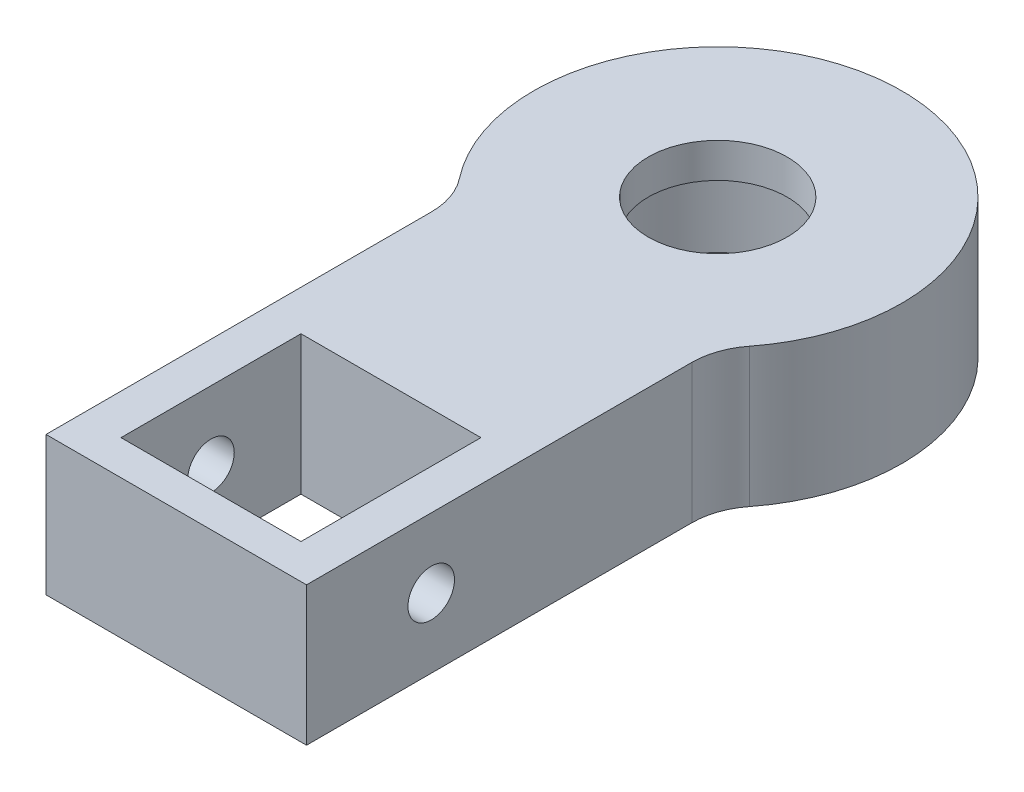
ISO-10303-21;
HEADER;
FILE_DESCRIPTION(('STEP AP214'),'2;1');
FILE_NAME('part.step','',(''),(''),'','','');
FILE_SCHEMA(('AUTOMOTIVE_DESIGN { 1 0 10303 214 1 1 1 1 }'));
ENDSEC;
DATA;
#1=APPLICATION_CONTEXT('core data for automotive mechanical design processes');
#2=APPLICATION_PROTOCOL_DEFINITION('international standard','automotive_design',2000,#1);
#3=PRODUCT_CONTEXT('',#1,'mechanical');
#4=PRODUCT('Part','Part','',(#3));
#5=PRODUCT_RELATED_PRODUCT_CATEGORY('part','',(#4));
#6=PRODUCT_DEFINITION_FORMATION('','',#4);
#7=PRODUCT_DEFINITION_CONTEXT('part definition',#1,'design');
#8=PRODUCT_DEFINITION('design','',#6,#7);
#9=PRODUCT_DEFINITION_SHAPE('','',#8);
#10=(LENGTH_UNIT() NAMED_UNIT(*) SI_UNIT(.MILLI.,.METRE.));
#11=(NAMED_UNIT(*) PLANE_ANGLE_UNIT() SI_UNIT($,.RADIAN.));
#12=(NAMED_UNIT(*) SI_UNIT($,.STERADIAN.) SOLID_ANGLE_UNIT());
#13=UNCERTAINTY_MEASURE_WITH_UNIT(LENGTH_MEASURE(1.E-05),#10,'distance_accuracy_value','');
#14=(GEOMETRIC_REPRESENTATION_CONTEXT(3) GLOBAL_UNCERTAINTY_ASSIGNED_CONTEXT((#13)) GLOBAL_UNIT_ASSIGNED_CONTEXT((#10,
#11,#12)) REPRESENTATION_CONTEXT('',''));
#15=CARTESIAN_POINT('',(0.,0.,0.));
#16=DIRECTION('',(0.,0.,1.));
#17=DIRECTION('',(1.,0.,0.));
#18=AXIS2_PLACEMENT_3D('',#15,#16,#17);
#19=CARTESIAN_POINT('',(0.,10.,0.));
#20=DIRECTION('',(0.,-1.,0.));
#21=DIRECTION('',(0.,0.,-1.));
#22=AXIS2_PLACEMENT_3D('',#19,#20,#21);
#23=CYLINDRICAL_SURFACE('',#22,18.5);
#24=CARTESIAN_POINT('',(0.,-10.,0.));
#25=DIRECTION('',(0.,1.,0.));
#26=DIRECTION('',(0.,0.,1.));
#27=AXIS2_PLACEMENT_3D('',#24,#25,#26);
#28=CIRCLE('',#27,18.5);
#29=CARTESIAN_POINT('',(0.,-10.,18.5));
#30=VERTEX_POINT('',#29);
#31=EDGE_CURVE('E137',#30,#30,#28,.T.);
#32=ORIENTED_EDGE('',*,*,#31,.F.);
#33=EDGE_LOOP('',(#32));
#34=FACE_BOUND('',#33,.T.);
#35=CARTESIAN_POINT('',(0.,5.,0.));
#36=DIRECTION('',(0.,1.,0.));
#37=DIRECTION('',(0.,0.,1.));
#38=AXIS2_PLACEMENT_3D('',#35,#36,#37);
#39=CIRCLE('',#38,18.5);
#40=CARTESIAN_POINT('',(0.,5.,18.5));
#41=VERTEX_POINT('',#40);
#42=EDGE_CURVE('E157',#41,#41,#39,.T.);
#43=ORIENTED_EDGE('',*,*,#42,.T.);
#44=EDGE_LOOP('',(#43));
#45=FACE_BOUND('',#44,.T.);
#46=ADVANCED_FACE('F38',(#34,#45),#23,.F.);
#47=CARTESIAN_POINT('',(0.,10.,0.));
#48=DIRECTION('',(0.,-1.,0.));
#49=DIRECTION('',(0.,0.,-1.));
#50=AXIS2_PLACEMENT_3D('',#47,#48,#49);
#51=PLANE('',#50);
#52=DIRECTION('',(0.,0.,-1.));
#53=VECTOR('',#52,1.);
#54=CARTESIAN_POINT('',(18.754,10.,77.954));
#55=LINE('',#54,#53);
#56=CARTESIAN_POINT('',(18.754,10.,77.954));
#57=VERTEX_POINT('',#56);
#58=CARTESIAN_POINT('',(18.754,10.,22.4823816354051));
#59=VERTEX_POINT('',#58);
#60=EDGE_CURVE('E189',#57,#59,#55,.T.);
#61=ORIENTED_EDGE('',*,*,#60,.T.);
#62=CARTESIAN_POINT('',(28.754,10.,22.4823816354051));
#63=DIRECTION('',(0.,-1.,0.));
#64=DIRECTION('',(0.,0.,-1.));
#65=AXIS2_PLACEMENT_3D('',#62,#63,#64);
#66=CIRCLE('',#65,10.);
#67=CARTESIAN_POINT('',(20.8761917808219,10.,16.3228250229653));
#68=VERTEX_POINT('',#67);
#69=EDGE_CURVE('E11',#59,#68,#66,.T.);
#70=ORIENTED_EDGE('',*,*,#69,.T.);
#71=CARTESIAN_POINT('',(0.,10.,0.));
#72=DIRECTION('',(0.,1.,0.));
#73=DIRECTION('',(0.,0.,-1.));
#74=AXIS2_PLACEMENT_3D('',#71,#72,#73);
#75=CIRCLE('',#74,26.5);
#76=CARTESIAN_POINT('',(-20.8761917808219,10.,16.3228250229653));
#77=VERTEX_POINT('',#76);
#78=EDGE_CURVE('E178',#68,#77,#75,.T.);
#79=ORIENTED_EDGE('',*,*,#78,.T.);
#80=CARTESIAN_POINT('',(-28.754,10.,22.4823816354051));
#81=DIRECTION('',(0.,-1.,0.));
#82=DIRECTION('',(0.,0.,-1.));
#83=AXIS2_PLACEMENT_3D('',#80,#81,#82);
#84=CIRCLE('',#83,10.);
#85=CARTESIAN_POINT('',(-18.754,10.,22.4823816354051));
#86=VERTEX_POINT('',#85);
#87=EDGE_CURVE('E236',#77,#86,#84,.T.);
#88=ORIENTED_EDGE('',*,*,#87,.T.);
#89=DIRECTION('',(0.,0.,1.));
#90=VECTOR('',#89,1.);
#91=CARTESIAN_POINT('',(-18.754,10.,77.954));
#92=LINE('',#91,#90);
#93=CARTESIAN_POINT('',(-18.754,10.,77.954));
#94=VERTEX_POINT('',#93);
#95=EDGE_CURVE('E182',#86,#94,#92,.T.);
#96=ORIENTED_EDGE('',*,*,#95,.T.);
#97=DIRECTION('',(1.,0.,0.));
#98=VECTOR('',#97,1.);
#99=CARTESIAN_POINT('',(-18.754,10.,77.954));
#100=LINE('',#99,#98);
#101=EDGE_CURVE('E186',#94,#57,#100,.T.);
#102=ORIENTED_EDGE('',*,*,#101,.T.);
#103=EDGE_LOOP('',(#61,#70,#79,#88,#96,#102));
#104=FACE_BOUND('',#103,.T.);
#105=DIRECTION('',(0.,0.,-1.));
#106=VECTOR('',#105,1.);
#107=CARTESIAN_POINT('',(12.954,10.,72.954));
#108=LINE('',#107,#106);
#109=CARTESIAN_POINT('',(12.954,10.,72.954));
#110=VERTEX_POINT('',#109);
#111=CARTESIAN_POINT('',(12.954,10.,47.046));
#112=VERTEX_POINT('',#111);
#113=EDGE_CURVE('E117',#110,#112,#108,.T.);
#114=ORIENTED_EDGE('',*,*,#113,.F.);
#115=DIRECTION('',(1.,0.,0.));
#116=VECTOR('',#115,1.);
#117=CARTESIAN_POINT('',(-12.954,10.,72.954));
#118=LINE('',#117,#116);
#119=CARTESIAN_POINT('',(-12.954,10.,72.954));
#120=VERTEX_POINT('',#119);
#121=EDGE_CURVE('E148',#120,#110,#118,.T.);
#122=ORIENTED_EDGE('',*,*,#121,.F.);
#123=DIRECTION('',(0.,0.,1.));
#124=VECTOR('',#123,1.);
#125=CARTESIAN_POINT('',(-12.954,10.,72.954));
#126=LINE('',#125,#124);
#127=CARTESIAN_POINT('',(-12.954,10.,47.046));
#128=VERTEX_POINT('',#127);
#129=EDGE_CURVE('E144',#128,#120,#126,.T.);
#130=ORIENTED_EDGE('',*,*,#129,.F.);
#131=DIRECTION('',(-1.,0.,0.));
#132=VECTOR('',#131,1.);
#133=CARTESIAN_POINT('',(-12.954,10.,47.046));
#134=LINE('',#133,#132);
#135=EDGE_CURVE('E128',#112,#128,#134,.T.);
#136=ORIENTED_EDGE('',*,*,#135,.F.);
#137=EDGE_LOOP('',(#114,#122,#130,#136));
#138=FACE_BOUND('',#137,.T.);
#139=CARTESIAN_POINT('',(0.,10.,0.));
#140=DIRECTION('',(0.,1.,0.));
#141=DIRECTION('',(0.,0.,1.));
#142=AXIS2_PLACEMENT_3D('',#139,#140,#141);
#143=CIRCLE('',#142,10.);
#144=CARTESIAN_POINT('',(0.,10.,10.));
#145=VERTEX_POINT('',#144);
#146=EDGE_CURVE('E346',#145,#145,#143,.T.);
#147=ORIENTED_EDGE('',*,*,#146,.F.);
#148=EDGE_LOOP('',(#147));
#149=FACE_BOUND('',#148,.T.);
#150=ADVANCED_FACE('F141',(#104,#138,#149),#51,.F.);
#151=CARTESIAN_POINT('',(0.,-10.,0.));
#152=DIRECTION('',(0.,-1.,0.));
#153=DIRECTION('',(0.,0.,-1.));
#154=AXIS2_PLACEMENT_3D('',#151,#152,#153);
#155=PLANE('',#154);
#156=CARTESIAN_POINT('',(0.,-10.,0.));
#157=DIRECTION('',(0.,1.,0.));
#158=DIRECTION('',(0.,0.,-1.));
#159=AXIS2_PLACEMENT_3D('',#156,#157,#158);
#160=CIRCLE('',#159,26.5);
#161=CARTESIAN_POINT('',(20.8761917808219,-10.,16.3228250229653));
#162=VERTEX_POINT('',#161);
#163=CARTESIAN_POINT('',(-20.8761917808219,-10.,16.3228250229653));
#164=VERTEX_POINT('',#163);
#165=EDGE_CURVE('E177',#162,#164,#160,.T.);
#166=ORIENTED_EDGE('',*,*,#165,.F.);
#167=CARTESIAN_POINT('',(28.754,-10.,22.4823816354051));
#168=DIRECTION('',(0.,-1.,0.));
#169=DIRECTION('',(0.,0.,-1.));
#170=AXIS2_PLACEMENT_3D('',#167,#168,#169);
#171=CIRCLE('',#170,10.);
#172=CARTESIAN_POINT('',(18.754,-10.,22.4823816354051));
#173=VERTEX_POINT('',#172);
#174=EDGE_CURVE('E47',#162,#173,#171,.F.);
#175=ORIENTED_EDGE('',*,*,#174,.T.);
#176=DIRECTION('',(0.,0.,-1.));
#177=VECTOR('',#176,1.);
#178=CARTESIAN_POINT('',(18.754,-10.,77.954));
#179=LINE('',#178,#177);
#180=CARTESIAN_POINT('',(18.754,-10.,77.954));
#181=VERTEX_POINT('',#180);
#182=EDGE_CURVE('E183',#181,#173,#179,.T.);
#183=ORIENTED_EDGE('',*,*,#182,.F.);
#184=DIRECTION('',(1.,0.,0.));
#185=VECTOR('',#184,1.);
#186=CARTESIAN_POINT('',(-18.754,-10.,77.954));
#187=LINE('',#186,#185);
#188=CARTESIAN_POINT('',(-18.754,-10.,77.954));
#189=VERTEX_POINT('',#188);
#190=EDGE_CURVE('E199',#189,#181,#187,.T.);
#191=ORIENTED_EDGE('',*,*,#190,.F.);
#192=DIRECTION('',(0.,0.,1.));
#193=VECTOR('',#192,1.);
#194=CARTESIAN_POINT('',(-18.754,-10.,77.954));
#195=LINE('',#194,#193);
#196=CARTESIAN_POINT('',(-18.754,-10.,22.4823816354051));
#197=VERTEX_POINT('',#196);
#198=EDGE_CURVE('E196',#197,#189,#195,.T.);
#199=ORIENTED_EDGE('',*,*,#198,.F.);
#200=CARTESIAN_POINT('',(-28.754,-10.,22.4823816354051));
#201=DIRECTION('',(0.,-1.,0.));
#202=DIRECTION('',(0.,0.,-1.));
#203=AXIS2_PLACEMENT_3D('',#200,#201,#202);
#204=CIRCLE('',#203,10.);
#205=EDGE_CURVE('E233',#197,#164,#204,.F.);
#206=ORIENTED_EDGE('',*,*,#205,.T.);
#207=EDGE_LOOP('',(#166,#175,#183,#191,#199,#206));
#208=FACE_BOUND('',#207,.T.);
#209=ORIENTED_EDGE('',*,*,#31,.T.);
#210=EDGE_LOOP('',(#209));
#211=FACE_BOUND('',#210,.T.);
#212=DIRECTION('',(1.,0.,0.));
#213=VECTOR('',#212,1.);
#214=CARTESIAN_POINT('',(-12.954,-10.,72.954));
#215=LINE('',#214,#213);
#216=CARTESIAN_POINT('',(-12.954,-10.,72.954));
#217=VERTEX_POINT('',#216);
#218=CARTESIAN_POINT('',(12.954,-10.,72.954));
#219=VERTEX_POINT('',#218);
#220=EDGE_CURVE('E129',#217,#219,#215,.T.);
#221=ORIENTED_EDGE('',*,*,#220,.T.);
#222=DIRECTION('',(0.,0.,-1.));
#223=VECTOR('',#222,1.);
#224=CARTESIAN_POINT('',(12.954,-10.,72.954));
#225=LINE('',#224,#223);
#226=CARTESIAN_POINT('',(12.954,-10.,47.046));
#227=VERTEX_POINT('',#226);
#228=EDGE_CURVE('E154',#219,#227,#225,.T.);
#229=ORIENTED_EDGE('',*,*,#228,.T.);
#230=DIRECTION('',(-1.,0.,0.));
#231=VECTOR('',#230,1.);
#232=CARTESIAN_POINT('',(-12.954,-10.,47.046));
#233=LINE('',#232,#231);
#234=CARTESIAN_POINT('',(-12.954,-10.,47.046));
#235=VERTEX_POINT('',#234);
#236=EDGE_CURVE('E135',#227,#235,#233,.T.);
#237=ORIENTED_EDGE('',*,*,#236,.T.);
#238=DIRECTION('',(0.,0.,1.));
#239=VECTOR('',#238,1.);
#240=CARTESIAN_POINT('',(-12.954,-10.,72.954));
#241=LINE('',#240,#239);
#242=EDGE_CURVE('E160',#235,#217,#241,.T.);
#243=ORIENTED_EDGE('',*,*,#242,.T.);
#244=EDGE_LOOP('',(#221,#229,#237,#243));
#245=FACE_BOUND('',#244,.T.);
#246=ADVANCED_FACE('F252',(#208,#211,#245),#155,.T.);
#247=CARTESIAN_POINT('',(0.,10.,0.));
#248=DIRECTION('',(0.,-1.,0.));
#249=DIRECTION('',(0.,0.,-1.));
#250=AXIS2_PLACEMENT_3D('',#247,#248,#249);
#251=CYLINDRICAL_SURFACE('',#250,26.5);
#252=ORIENTED_EDGE('',*,*,#165,.T.);
#253=DIRECTION('',(0.,-1.,0.));
#254=VECTOR('',#253,1.);
#255=CARTESIAN_POINT('',(-20.8761917808219,10.,16.3228250229653));
#256=LINE('',#255,#254);
#257=EDGE_CURVE('E228',#164,#77,#256,.F.);
#258=ORIENTED_EDGE('',*,*,#257,.T.);
#259=ORIENTED_EDGE('',*,*,#78,.F.);
#260=DIRECTION('',(0.,-1.,0.));
#261=VECTOR('',#260,1.);
#262=CARTESIAN_POINT('',(20.8761917808219,10.,16.3228250229653));
#263=LINE('',#262,#261);
#264=EDGE_CURVE('E224',#68,#162,#263,.T.);
#265=ORIENTED_EDGE('',*,*,#264,.T.);
#266=EDGE_LOOP('',(#252,#258,#259,#265));
#267=FACE_BOUND('',#266,.T.);
#268=ADVANCED_FACE('F256',(#267),#251,.T.);
#269=CARTESIAN_POINT('',(-18.754,10.,77.954));
#270=DIRECTION('',(1.,0.,0.));
#271=DIRECTION('',(0.,0.,-1.));
#272=AXIS2_PLACEMENT_3D('',#269,#270,#271);
#273=PLANE('',#272);
#274=CARTESIAN_POINT('',(-18.754,0.,60.));
#275=DIRECTION('',(1.,0.,0.));
#276=DIRECTION('',(0.,0.,-1.));
#277=AXIS2_PLACEMENT_3D('',#274,#275,#276);
#278=CIRCLE('',#277,3.35);
#279=CARTESIAN_POINT('',(-18.754,0.,56.65));
#280=VERTEX_POINT('',#279);
#281=EDGE_CURVE('E340',#280,#280,#278,.F.);
#282=ORIENTED_EDGE('',*,*,#281,.F.);
#283=EDGE_LOOP('',(#282));
#284=FACE_BOUND('',#283,.T.);
#285=ORIENTED_EDGE('',*,*,#95,.F.);
#286=DIRECTION('',(0.,1.,0.));
#287=VECTOR('',#286,1.);
#288=CARTESIAN_POINT('',(-18.754,-10.,22.4823816354051));
#289=LINE('',#288,#287);
#290=EDGE_CURVE('E211',#86,#197,#289,.F.);
#291=ORIENTED_EDGE('',*,*,#290,.T.);
#292=ORIENTED_EDGE('',*,*,#198,.T.);
#293=DIRECTION('',(0.,-1.,0.));
#294=VECTOR('',#293,1.);
#295=CARTESIAN_POINT('',(-18.754,10.,77.954));
#296=LINE('',#295,#294);
#297=EDGE_CURVE('E207',#94,#189,#296,.T.);
#298=ORIENTED_EDGE('',*,*,#297,.F.);
#299=EDGE_LOOP('',(#285,#291,#292,#298));
#300=FACE_BOUND('',#299,.T.);
#301=ADVANCED_FACE('F248',(#284,#300),#273,.F.);
#302=CARTESIAN_POINT('',(-18.754,10.,77.954));
#303=DIRECTION('',(0.,0.,-1.));
#304=DIRECTION('',(-1.,0.,0.));
#305=AXIS2_PLACEMENT_3D('',#302,#303,#304);
#306=PLANE('',#305);
#307=ORIENTED_EDGE('',*,*,#190,.T.);
#308=DIRECTION('',(0.,-1.,0.));
#309=VECTOR('',#308,1.);
#310=CARTESIAN_POINT('',(18.754,10.,77.954));
#311=LINE('',#310,#309);
#312=EDGE_CURVE('E192',#57,#181,#311,.T.);
#313=ORIENTED_EDGE('',*,*,#312,.F.);
#314=ORIENTED_EDGE('',*,*,#101,.F.);
#315=ORIENTED_EDGE('',*,*,#297,.T.);
#316=EDGE_LOOP('',(#307,#313,#314,#315));
#317=FACE_BOUND('',#316,.T.);
#318=ADVANCED_FACE('F263',(#317),#306,.F.);
#319=CARTESIAN_POINT('',(18.754,10.,77.954));
#320=DIRECTION('',(-1.,0.,0.));
#321=DIRECTION('',(0.,0.,1.));
#322=AXIS2_PLACEMENT_3D('',#319,#320,#321);
#323=PLANE('',#322);
#324=CARTESIAN_POINT('',(18.754,0.,60.));
#325=DIRECTION('',(-1.,0.,0.));
#326=DIRECTION('',(0.,0.,1.));
#327=AXIS2_PLACEMENT_3D('',#324,#325,#326);
#328=CIRCLE('',#327,3.35);
#329=CARTESIAN_POINT('',(18.754,0.,63.35));
#330=VERTEX_POINT('',#329);
#331=EDGE_CURVE('E336',#330,#330,#328,.F.);
#332=ORIENTED_EDGE('',*,*,#331,.F.);
#333=EDGE_LOOP('',(#332));
#334=FACE_BOUND('',#333,.T.);
#335=ORIENTED_EDGE('',*,*,#182,.T.);
#336=DIRECTION('',(0.,1.,0.));
#337=VECTOR('',#336,1.);
#338=CARTESIAN_POINT('',(18.754,10.,22.4823816354051));
#339=LINE('',#338,#337);
#340=EDGE_CURVE('E54',#173,#59,#339,.T.);
#341=ORIENTED_EDGE('',*,*,#340,.T.);
#342=ORIENTED_EDGE('',*,*,#60,.F.);
#343=ORIENTED_EDGE('',*,*,#312,.T.);
#344=EDGE_LOOP('',(#335,#341,#342,#343));
#345=FACE_BOUND('',#344,.T.);
#346=ADVANCED_FACE('F261',(#334,#345),#323,.F.);
#347=CARTESIAN_POINT('',(12.954,10.,72.954));
#348=DIRECTION('',(-1.,0.,0.));
#349=DIRECTION('',(0.,0.,1.));
#350=AXIS2_PLACEMENT_3D('',#347,#348,#349);
#351=PLANE('',#350);
#352=CARTESIAN_POINT('',(12.954,0.,60.));
#353=DIRECTION('',(-1.,0.,0.));
#354=DIRECTION('',(0.,0.,1.));
#355=AXIS2_PLACEMENT_3D('',#352,#353,#354);
#356=CIRCLE('',#355,3.35);
#357=CARTESIAN_POINT('',(12.954,0.,63.35));
#358=VERTEX_POINT('',#357);
#359=EDGE_CURVE('E220',#358,#358,#356,.F.);
#360=ORIENTED_EDGE('',*,*,#359,.T.);
#361=EDGE_LOOP('',(#360));
#362=FACE_BOUND('',#361,.T.);
#363=ORIENTED_EDGE('',*,*,#228,.F.);
#364=DIRECTION('',(0.,-1.,0.));
#365=VECTOR('',#364,1.);
#366=CARTESIAN_POINT('',(12.954,10.,72.954));
#367=LINE('',#366,#365);
#368=EDGE_CURVE('E123',#110,#219,#367,.T.);
#369=ORIENTED_EDGE('',*,*,#368,.F.);
#370=ORIENTED_EDGE('',*,*,#113,.T.);
#371=DIRECTION('',(0.,-1.,0.));
#372=VECTOR('',#371,1.);
#373=CARTESIAN_POINT('',(12.954,10.,47.046));
#374=LINE('',#373,#372);
#375=EDGE_CURVE('E120',#112,#227,#374,.T.);
#376=ORIENTED_EDGE('',*,*,#375,.T.);
#377=EDGE_LOOP('',(#363,#369,#370,#376));
#378=FACE_BOUND('',#377,.T.);
#379=ADVANCED_FACE('F119',(#362,#378),#351,.T.);
#380=CARTESIAN_POINT('',(-12.954,10.,47.046));
#381=DIRECTION('',(0.,0.,1.));
#382=DIRECTION('',(1.,0.,0.));
#383=AXIS2_PLACEMENT_3D('',#380,#381,#382);
#384=PLANE('',#383);
#385=ORIENTED_EDGE('',*,*,#236,.F.);
#386=ORIENTED_EDGE('',*,*,#375,.F.);
#387=ORIENTED_EDGE('',*,*,#135,.T.);
#388=DIRECTION('',(0.,-1.,0.));
#389=VECTOR('',#388,1.);
#390=CARTESIAN_POINT('',(-12.954,10.,47.046));
#391=LINE('',#390,#389);
#392=EDGE_CURVE('E138',#128,#235,#391,.T.);
#393=ORIENTED_EDGE('',*,*,#392,.T.);
#394=EDGE_LOOP('',(#385,#386,#387,#393));
#395=FACE_BOUND('',#394,.T.);
#396=ADVANCED_FACE('F132',(#395),#384,.T.);
#397=CARTESIAN_POINT('',(-12.954,10.,72.954));
#398=DIRECTION('',(1.,0.,0.));
#399=DIRECTION('',(0.,0.,-1.));
#400=AXIS2_PLACEMENT_3D('',#397,#398,#399);
#401=PLANE('',#400);
#402=CARTESIAN_POINT('',(-12.954,0.,60.));
#403=DIRECTION('',(1.,0.,0.));
#404=DIRECTION('',(0.,0.,-1.));
#405=AXIS2_PLACEMENT_3D('',#402,#403,#404);
#406=CIRCLE('',#405,3.35);
#407=CARTESIAN_POINT('',(-12.954,0.,56.65));
#408=VERTEX_POINT('',#407);
#409=EDGE_CURVE('E216',#408,#408,#406,.F.);
#410=ORIENTED_EDGE('',*,*,#409,.T.);
#411=EDGE_LOOP('',(#410));
#412=FACE_BOUND('',#411,.T.);
#413=ORIENTED_EDGE('',*,*,#242,.F.);
#414=ORIENTED_EDGE('',*,*,#392,.F.);
#415=ORIENTED_EDGE('',*,*,#129,.T.);
#416=DIRECTION('',(0.,-1.,0.));
#417=VECTOR('',#416,1.);
#418=CARTESIAN_POINT('',(-12.954,10.,72.954));
#419=LINE('',#418,#417);
#420=EDGE_CURVE('E169',#120,#217,#419,.T.);
#421=ORIENTED_EDGE('',*,*,#420,.T.);
#422=EDGE_LOOP('',(#413,#414,#415,#421));
#423=FACE_BOUND('',#422,.T.);
#424=ADVANCED_FACE('F323',(#412,#423),#401,.T.);
#425=CARTESIAN_POINT('',(-12.954,10.,72.954));
#426=DIRECTION('',(0.,0.,-1.));
#427=DIRECTION('',(-1.,0.,0.));
#428=AXIS2_PLACEMENT_3D('',#425,#426,#427);
#429=PLANE('',#428);
#430=ORIENTED_EDGE('',*,*,#220,.F.);
#431=ORIENTED_EDGE('',*,*,#420,.F.);
#432=ORIENTED_EDGE('',*,*,#121,.T.);
#433=ORIENTED_EDGE('',*,*,#368,.T.);
#434=EDGE_LOOP('',(#430,#431,#432,#433));
#435=FACE_BOUND('',#434,.T.);
#436=ADVANCED_FACE('F319',(#435),#429,.T.);
#437=CARTESIAN_POINT('',(0.,5.,0.));
#438=DIRECTION('',(0.,1.,0.));
#439=DIRECTION('',(0.,0.,1.));
#440=AXIS2_PLACEMENT_3D('',#437,#438,#439);
#441=PLANE('',#440);
#442=CARTESIAN_POINT('',(0.,5.,0.));
#443=DIRECTION('',(0.,1.,0.));
#444=DIRECTION('',(0.,0.,1.));
#445=AXIS2_PLACEMENT_3D('',#442,#443,#444);
#446=CIRCLE('',#445,10.);
#447=CARTESIAN_POINT('',(0.,5.,10.));
#448=VERTEX_POINT('',#447);
#449=EDGE_CURVE('E215',#448,#448,#446,.T.);
#450=ORIENTED_EDGE('',*,*,#449,.T.);
#451=EDGE_LOOP('',(#450));
#452=FACE_BOUND('',#451,.T.);
#453=ORIENTED_EDGE('',*,*,#42,.F.);
#454=EDGE_LOOP('',(#453));
#455=FACE_BOUND('',#454,.T.);
#456=ADVANCED_FACE('F315',(#452,#455),#441,.F.);
#457=CARTESIAN_POINT('',(0.,5.,0.));
#458=DIRECTION('',(0.,1.,0.));
#459=DIRECTION('',(0.,0.,1.));
#460=AXIS2_PLACEMENT_3D('',#457,#458,#459);
#461=CYLINDRICAL_SURFACE('',#460,10.);
#462=ORIENTED_EDGE('',*,*,#449,.F.);
#463=EDGE_LOOP('',(#462));
#464=FACE_BOUND('',#463,.T.);
#465=ORIENTED_EDGE('',*,*,#146,.T.);
#466=EDGE_LOOP('',(#465));
#467=FACE_BOUND('',#466,.T.);
#468=ADVANCED_FACE('F308',(#464,#467),#461,.F.);
#469=CARTESIAN_POINT('',(-24.4941503255873,0.,60.));
#470=DIRECTION('',(-1.,0.,0.));
#471=DIRECTION('',(0.,0.,1.));
#472=AXIS2_PLACEMENT_3D('',#469,#470,#471);
#473=CYLINDRICAL_SURFACE('',#472,3.35);
#474=ORIENTED_EDGE('',*,*,#409,.F.);
#475=EDGE_LOOP('',(#474));
#476=FACE_BOUND('',#475,.T.);
#477=ORIENTED_EDGE('',*,*,#281,.T.);
#478=EDGE_LOOP('',(#477));
#479=FACE_BOUND('',#478,.T.);
#480=ADVANCED_FACE('F302',(#476,#479),#473,.F.);
#481=ORIENTED_EDGE('',*,*,#359,.F.);
#482=EDGE_LOOP('',(#481));
#483=FACE_BOUND('',#482,.T.);
#484=ORIENTED_EDGE('',*,*,#331,.T.);
#485=EDGE_LOOP('',(#484));
#486=FACE_BOUND('',#485,.T.);
#487=ADVANCED_FACE('F297',(#483,#486),#473,.F.);
#488=CARTESIAN_POINT('',(-28.754,10.,22.4823816354051));
#489=DIRECTION('',(0.,-1.,0.));
#490=DIRECTION('',(0.,0.,-1.));
#491=AXIS2_PLACEMENT_3D('',#488,#489,#490);
#492=CYLINDRICAL_SURFACE('',#491,10.);
#493=ORIENTED_EDGE('',*,*,#87,.F.);
#494=ORIENTED_EDGE('',*,*,#257,.F.);
#495=ORIENTED_EDGE('',*,*,#205,.F.);
#496=ORIENTED_EDGE('',*,*,#290,.F.);
#497=EDGE_LOOP('',(#493,#494,#495,#496));
#498=FACE_BOUND('',#497,.T.);
#499=ADVANCED_FACE('F251',(#498),#492,.F.);
#500=CARTESIAN_POINT('',(28.754,10.,22.4823816354051));
#501=DIRECTION('',(0.,-1.,0.));
#502=DIRECTION('',(0.,0.,-1.));
#503=AXIS2_PLACEMENT_3D('',#500,#501,#502);
#504=CYLINDRICAL_SURFACE('',#503,10.);
#505=ORIENTED_EDGE('',*,*,#69,.F.);
#506=ORIENTED_EDGE('',*,*,#340,.F.);
#507=ORIENTED_EDGE('',*,*,#174,.F.);
#508=ORIENTED_EDGE('',*,*,#264,.F.);
#509=EDGE_LOOP('',(#505,#506,#507,#508));
#510=FACE_BOUND('',#509,.T.);
#511=ADVANCED_FACE('F40',(#510),#504,.F.);
#512=CLOSED_SHELL('',(#46,#150,#246,#268,#301,#318,#346,#379,#396,#424,#436,#456,#468,#480,#487,
#499,#511));
#513=MANIFOLD_SOLID_BREP('B2',#512);
#514=ADVANCED_BREP_SHAPE_REPRESENTATION('',(#18,#513),#14);
#515=SHAPE_DEFINITION_REPRESENTATION(#9,#514);
ENDSEC;
END-ISO-10303-21;
